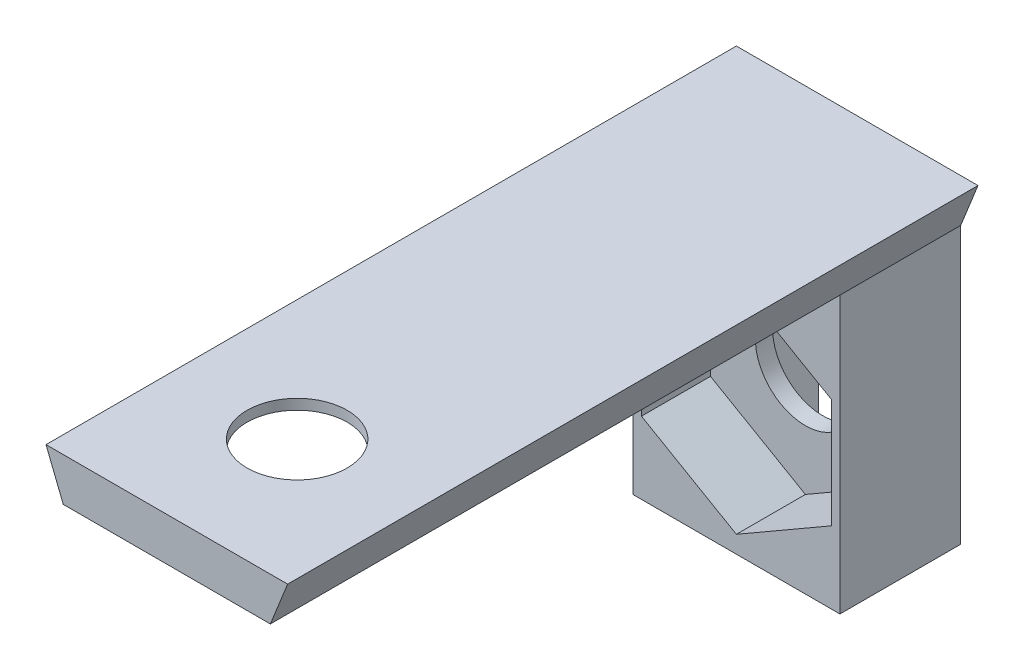
ISO-10303-21;
HEADER;
FILE_DESCRIPTION(('STEP AP214'),'2;1');
FILE_NAME('part.step','',(''),(''),'','','');
FILE_SCHEMA(('AUTOMOTIVE_DESIGN { 1 0 10303 214 1 1 1 1 }'));
ENDSEC;
DATA;
#1=APPLICATION_CONTEXT('core data for automotive mechanical design processes');
#2=APPLICATION_PROTOCOL_DEFINITION('international standard','automotive_design',2000,#1);
#3=PRODUCT_CONTEXT('',#1,'mechanical');
#4=PRODUCT('Part','Part','',(#3));
#5=PRODUCT_RELATED_PRODUCT_CATEGORY('part','',(#4));
#6=PRODUCT_DEFINITION_FORMATION('','',#4);
#7=PRODUCT_DEFINITION_CONTEXT('part definition',#1,'design');
#8=PRODUCT_DEFINITION('design','',#6,#7);
#9=PRODUCT_DEFINITION_SHAPE('','',#8);
#10=(LENGTH_UNIT() NAMED_UNIT(*) SI_UNIT(.MILLI.,.METRE.));
#11=(NAMED_UNIT(*) PLANE_ANGLE_UNIT() SI_UNIT($,.RADIAN.));
#12=(NAMED_UNIT(*) SI_UNIT($,.STERADIAN.) SOLID_ANGLE_UNIT());
#13=UNCERTAINTY_MEASURE_WITH_UNIT(LENGTH_MEASURE(1.E-05),#10,'distance_accuracy_value','');
#14=(GEOMETRIC_REPRESENTATION_CONTEXT(3) GLOBAL_UNCERTAINTY_ASSIGNED_CONTEXT((#13)) GLOBAL_UNIT_ASSIGNED_CONTEXT((#10,
#11,#12)) REPRESENTATION_CONTEXT('',''));
#15=CARTESIAN_POINT('',(0.,0.,0.));
#16=DIRECTION('',(0.,0.,1.));
#17=DIRECTION('',(1.,0.,0.));
#18=AXIS2_PLACEMENT_3D('',#15,#16,#17);
#19=CARTESIAN_POINT('',(0.,7.35,-3.501));
#20=DIRECTION('',(0.,0.,1.));
#21=DIRECTION('',(1.,0.,0.));
#22=AXIS2_PLACEMENT_3D('',#19,#20,#21);
#23=CYLINDRICAL_SURFACE('',#22,2.9);
#24=CARTESIAN_POINT('',(0.,7.35,-1.5));
#25=DIRECTION('',(0.,0.,1.));
#26=DIRECTION('',(1.,0.,0.));
#27=AXIS2_PLACEMENT_3D('',#24,#25,#26);
#28=CIRCLE('',#27,2.9);
#29=CARTESIAN_POINT('',(2.9,7.35,-1.5));
#30=VERTEX_POINT('',#29);
#31=EDGE_CURVE('E378',#30,#30,#28,.F.);
#32=CARTESIAN_POINT('',(0.,7.35,-0.500000000000002));
#33=DIRECTION('',(0.,0.,1.));
#34=DIRECTION('',(1.,0.,0.));
#35=AXIS2_PLACEMENT_3D('',#32,#33,#34);
#36=CIRCLE('',#35,2.9);
#37=CARTESIAN_POINT('',(2.9,7.35,-0.500000000000003));
#38=VERTEX_POINT('',#37);
#39=EDGE_CURVE('E43',#38,#38,#36,.F.);
#40=CARTESIAN_POINT('',(2.9,7.35,-1.5));
#41=CARTESIAN_POINT('',(2.9,7.35,-1.48958333333334));
#42=CARTESIAN_POINT('',(2.9,7.35,-1.47916666666667));
#43=CARTESIAN_POINT('',(2.9,7.35,-1.45833333333334));
#44=CARTESIAN_POINT('',(2.9,7.35,-1.44791666666667));
#45=CARTESIAN_POINT('',(2.9,7.35,-1.42708333333334));
#46=CARTESIAN_POINT('',(2.9,7.35,-1.41666666666667));
#47=CARTESIAN_POINT('',(2.9,7.35,-1.39583333333334));
#48=CARTESIAN_POINT('',(2.9,7.35,-1.38541666666667));
#49=CARTESIAN_POINT('',(2.9,7.35,-1.36458333333334));
#50=CARTESIAN_POINT('',(2.9,7.35,-1.35416666666667));
#51=CARTESIAN_POINT('',(2.9,7.35,-1.33333333333334));
#52=CARTESIAN_POINT('',(2.9,7.35,-1.32291666666667));
#53=CARTESIAN_POINT('',(2.9,7.35,-1.30208333333334));
#54=CARTESIAN_POINT('',(2.9,7.35,-1.29166666666667));
#55=CARTESIAN_POINT('',(2.9,7.35,-1.27083333333334));
#56=CARTESIAN_POINT('',(2.9,7.35,-1.26041666666667));
#57=CARTESIAN_POINT('',(2.9,7.35,-1.23958333333334));
#58=CARTESIAN_POINT('',(2.9,7.35,-1.22916666666667));
#59=CARTESIAN_POINT('',(2.9,7.35,-1.20833333333334));
#60=CARTESIAN_POINT('',(2.9,7.35,-1.19791666666667));
#61=CARTESIAN_POINT('',(2.9,7.35,-1.17708333333334));
#62=CARTESIAN_POINT('',(2.9,7.35,-1.16666666666667));
#63=CARTESIAN_POINT('',(2.9,7.35,-1.14583333333334));
#64=CARTESIAN_POINT('',(2.9,7.35,-1.13541666666667));
#65=CARTESIAN_POINT('',(2.9,7.35,-1.11458333333334));
#66=CARTESIAN_POINT('',(2.9,7.35,-1.10416666666667));
#67=CARTESIAN_POINT('',(2.9,7.35,-1.08333333333334));
#68=CARTESIAN_POINT('',(2.9,7.35,-1.07291666666667));
#69=CARTESIAN_POINT('',(2.9,7.35,-1.05208333333334));
#70=CARTESIAN_POINT('',(2.9,7.35,-1.04166666666667));
#71=CARTESIAN_POINT('',(2.9,7.35,-1.02083333333334));
#72=CARTESIAN_POINT('',(2.9,7.35,-1.01041666666667));
#73=CARTESIAN_POINT('',(2.9,7.35,-0.989583333333336));
#74=CARTESIAN_POINT('',(2.9,7.35,-0.979166666666669));
#75=CARTESIAN_POINT('',(2.9,7.35,-0.958333333333335));
#76=CARTESIAN_POINT('',(2.9,7.35,-0.947916666666669));
#77=CARTESIAN_POINT('',(2.9,7.35,-0.927083333333335));
#78=CARTESIAN_POINT('',(2.9,7.35,-0.916666666666669));
#79=CARTESIAN_POINT('',(2.9,7.35,-0.895833333333335));
#80=CARTESIAN_POINT('',(2.9,7.35,-0.885416666666669));
#81=CARTESIAN_POINT('',(2.9,7.35,-0.864583333333335));
#82=CARTESIAN_POINT('',(2.9,7.35,-0.854166666666669));
#83=CARTESIAN_POINT('',(2.9,7.35,-0.833333333333336));
#84=CARTESIAN_POINT('',(2.9,7.35,-0.822916666666669));
#85=CARTESIAN_POINT('',(2.9,7.35,-0.802083333333336));
#86=CARTESIAN_POINT('',(2.9,7.35,-0.791666666666669));
#87=CARTESIAN_POINT('',(2.9,7.35,-0.770833333333336));
#88=CARTESIAN_POINT('',(2.9,7.35,-0.760416666666669));
#89=CARTESIAN_POINT('',(2.9,7.35,-0.739583333333336));
#90=CARTESIAN_POINT('',(2.9,7.35,-0.729166666666669));
#91=CARTESIAN_POINT('',(2.9,7.35,-0.708333333333336));
#92=CARTESIAN_POINT('',(2.9,7.35,-0.697916666666669));
#93=CARTESIAN_POINT('',(2.9,7.35,-0.677083333333336));
#94=CARTESIAN_POINT('',(2.9,7.35,-0.666666666666669));
#95=CARTESIAN_POINT('',(2.9,7.35,-0.645833333333336));
#96=CARTESIAN_POINT('',(2.9,7.35,-0.635416666666669));
#97=CARTESIAN_POINT('',(2.9,7.35,-0.614583333333336));
#98=CARTESIAN_POINT('',(2.9,7.35,-0.604166666666669));
#99=CARTESIAN_POINT('',(2.9,7.35,-0.583333333333336));
#100=CARTESIAN_POINT('',(2.9,7.35,-0.572916666666669));
#101=CARTESIAN_POINT('',(2.9,7.35,-0.552083333333336));
#102=CARTESIAN_POINT('',(2.9,7.35,-0.541666666666669));
#103=CARTESIAN_POINT('',(2.9,7.35,-0.520833333333336));
#104=CARTESIAN_POINT('',(2.9,7.35,-0.510416666666669));
#105=CARTESIAN_POINT('',(2.9,7.35,-0.500000000000003));
#106=B_SPLINE_CURVE_WITH_KNOTS('',3,(#40,#41,#42,#43,#44,#45,#46,#47,#48,#49,#50,#51,#52,#53,
#54,#55,#56,#57,#58,#59,#60,#61,#62,#63,#64,#65,#66,#67,#68,#69,#70,#71,#72,#73,#74,#75,#76,#77,
#78,#79,#80,#81,#82,#83,#84,#85,#86,#87,#88,#89,#90,#91,#92,#93,#94,#95,#96,#97,#98,#99,#100,
#101,#102,#103,#104,#105),.UNSPECIFIED.,.F.,.F.,(4,2,2,2,2,2,2,2,2,2,2,2,2,2,2,2,2,2,2,2,2,2,2,
2,2,2,2,2,2,2,2,2,4),(0.,0.03125,0.0625000000000001,0.0937500000000001,0.125,0.15625,0.1875,
0.21875,0.25,0.28125,0.3125,0.34375,0.374999999999999,0.40625,0.4375,0.46875,0.5,0.53125,0.5625,
0.59375,0.625,0.65625,0.687499999999999,0.718749999999999,0.749999999999999,0.781249999999999,
0.812499999999999,0.843749999999999,0.874999999999999,0.906249999999999,0.937499999999999,
0.968749999999999,0.999999999999999),.UNSPECIFIED.);
#107=EDGE_CURVE('BSEAM39',#30,#38,#106,.T.);
#108=ORIENTED_EDGE('',*,*,#31,.T.);
#109=ORIENTED_EDGE('',*,*,#39,.F.);
#110=ORIENTED_EDGE('',*,*,#107,.T.);
#111=ORIENTED_EDGE('',*,*,#107,.F.);
#112=EDGE_LOOP('',(#108,#110,#109,#111));
#113=FACE_BOUND('',#112,.T.);
#114=ADVANCED_FACE('F39',(#113),#23,.F.);
#115=CARTESIAN_POINT('',(6.,16.,3.5));
#116=DIRECTION('',(-1.,0.,0.));
#117=DIRECTION('',(0.,0.,1.));
#118=AXIS2_PLACEMENT_3D('',#115,#116,#117);
#119=PLANE('',#118);
#120=DIRECTION('',(0.,0.,-1.));
#121=VECTOR('',#120,1.);
#122=CARTESIAN_POINT('',(6.,0.,3.5));
#123=LINE('',#122,#121);
#124=CARTESIAN_POINT('',(6.,0.,3.5));
#125=VERTEX_POINT('',#124);
#126=CARTESIAN_POINT('',(6.,0.,-3.5));
#127=VERTEX_POINT('',#126);
#128=EDGE_CURVE('E398',#125,#127,#123,.T.);
#129=ORIENTED_EDGE('',*,*,#128,.T.);
#130=DIRECTION('',(0.,-1.,0.));
#131=VECTOR('',#130,1.);
#132=CARTESIAN_POINT('',(6.,16.,-3.5));
#133=LINE('',#132,#131);
#134=CARTESIAN_POINT('',(6.,16.,-3.5));
#135=VERTEX_POINT('',#134);
#136=EDGE_CURVE('E443',#135,#127,#133,.T.);
#137=ORIENTED_EDGE('',*,*,#136,.F.);
#138=DIRECTION('',(0.,0.,-1.));
#139=VECTOR('',#138,1.);
#140=CARTESIAN_POINT('',(6.,16.,3.5));
#141=LINE('',#140,#139);
#142=CARTESIAN_POINT('',(6.,16.,3.5));
#143=VERTEX_POINT('',#142);
#144=EDGE_CURVE('E407',#143,#135,#141,.T.);
#145=ORIENTED_EDGE('',*,*,#144,.F.);
#146=DIRECTION('',(0.,-1.,0.));
#147=VECTOR('',#146,1.);
#148=CARTESIAN_POINT('',(6.,16.,3.5));
#149=LINE('',#148,#147);
#150=EDGE_CURVE('E418',#143,#125,#149,.T.);
#151=ORIENTED_EDGE('',*,*,#150,.T.);
#152=EDGE_LOOP('',(#129,#137,#145,#151));
#153=FACE_BOUND('',#152,.T.);
#154=ADVANCED_FACE('F41',(#153),#119,.F.);
#155=CARTESIAN_POINT('',(-6.,16.,-3.5));
#156=DIRECTION('',(0.,0.,1.));
#157=DIRECTION('',(1.,0.,0.));
#158=AXIS2_PLACEMENT_3D('',#155,#156,#157);
#159=PLANE('',#158);
#160=DIRECTION('',(-1.,0.,0.));
#161=VECTOR('',#160,1.);
#162=CARTESIAN_POINT('',(-7.,18.5,-3.5));
#163=LINE('',#162,#161);
#164=CARTESIAN_POINT('',(7.,18.5,-3.5));
#165=VERTEX_POINT('',#164);
#166=CARTESIAN_POINT('',(-7.,18.5,-3.5));
#167=VERTEX_POINT('',#166);
#168=EDGE_CURVE('E304',#165,#167,#163,.T.);
#169=ORIENTED_EDGE('',*,*,#168,.F.);
#170=DIRECTION('',(0.371390676354104,0.928476690885259,0.));
#171=VECTOR('',#170,1.);
#172=CARTESIAN_POINT('',(7.,18.5,-3.5));
#173=LINE('',#172,#171);
#174=EDGE_CURVE('E272',#135,#165,#173,.T.);
#175=ORIENTED_EDGE('',*,*,#174,.F.);
#176=ORIENTED_EDGE('',*,*,#136,.T.);
#177=DIRECTION('',(-1.,0.,0.));
#178=VECTOR('',#177,1.);
#179=CARTESIAN_POINT('',(-6.,0.,-3.5));
#180=LINE('',#179,#178);
#181=CARTESIAN_POINT('',(2.25,0.,-3.5));
#182=VERTEX_POINT('',#181);
#183=EDGE_CURVE('E423',#127,#182,#180,.T.);
#184=ORIENTED_EDGE('',*,*,#183,.T.);
#185=DIRECTION('',(0.,1.,0.));
#186=VECTOR('',#185,1.);
#187=CARTESIAN_POINT('',(2.25,-4.,-3.5));
#188=LINE('',#187,#186);
#189=CARTESIAN_POINT('',(2.25,16.,-3.5));
#190=VERTEX_POINT('',#189);
#191=EDGE_CURVE('E394',#182,#190,#188,.T.);
#192=ORIENTED_EDGE('',*,*,#191,.T.);
#193=DIRECTION('',(-1.,0.,0.));
#194=VECTOR('',#193,1.);
#195=CARTESIAN_POINT('',(-7.,16.,-3.5));
#196=LINE('',#195,#194);
#197=CARTESIAN_POINT('',(-2.25,16.,-3.5));
#198=VERTEX_POINT('',#197);
#199=EDGE_CURVE('E296',#190,#198,#196,.T.);
#200=ORIENTED_EDGE('',*,*,#199,.T.);
#201=DIRECTION('',(0.,1.,0.));
#202=VECTOR('',#201,1.);
#203=CARTESIAN_POINT('',(-2.25,-4.,-3.5));
#204=LINE('',#203,#202);
#205=CARTESIAN_POINT('',(-2.25,0.,-3.5));
#206=VERTEX_POINT('',#205);
#207=EDGE_CURVE('E393',#206,#198,#204,.T.);
#208=ORIENTED_EDGE('',*,*,#207,.F.);
#209=CARTESIAN_POINT('',(-6.,0.,-3.5));
#210=VERTEX_POINT('',#209);
#211=EDGE_CURVE('E422',#206,#210,#180,.T.);
#212=ORIENTED_EDGE('',*,*,#211,.T.);
#213=DIRECTION('',(0.,-1.,0.));
#214=VECTOR('',#213,1.);
#215=CARTESIAN_POINT('',(-6.,16.,-3.5));
#216=LINE('',#215,#214);
#217=CARTESIAN_POINT('',(-6.,16.,-3.5));
#218=VERTEX_POINT('',#217);
#219=EDGE_CURVE('E439',#218,#210,#216,.T.);
#220=ORIENTED_EDGE('',*,*,#219,.F.);
#221=DIRECTION('',(0.371390676354104,-0.928476690885259,0.));
#222=VECTOR('',#221,1.);
#223=CARTESIAN_POINT('',(-6.,16.,-3.5));
#224=LINE('',#223,#222);
#225=EDGE_CURVE('E260',#167,#218,#224,.T.);
#226=ORIENTED_EDGE('',*,*,#225,.F.);
#227=EDGE_LOOP('',(#169,#175,#176,#184,#192,#200,#208,#212,#220,#226));
#228=FACE_BOUND('',#227,.T.);
#229=ADVANCED_FACE('F468',(#228),#159,.F.);
#230=CARTESIAN_POINT('',(-6.,16.,3.5));
#231=DIRECTION('',(1.,0.,0.));
#232=DIRECTION('',(0.,0.,-1.));
#233=AXIS2_PLACEMENT_3D('',#230,#231,#232);
#234=PLANE('',#233);
#235=DIRECTION('',(0.,0.,1.));
#236=VECTOR('',#235,1.);
#237=CARTESIAN_POINT('',(-6.,0.,3.5));
#238=LINE('',#237,#236);
#239=CARTESIAN_POINT('',(-6.,0.,3.5));
#240=VERTEX_POINT('',#239);
#241=EDGE_CURVE('E427',#210,#240,#238,.T.);
#242=ORIENTED_EDGE('',*,*,#241,.T.);
#243=DIRECTION('',(0.,-1.,0.));
#244=VECTOR('',#243,1.);
#245=CARTESIAN_POINT('',(-6.,16.,3.5));
#246=LINE('',#245,#244);
#247=CARTESIAN_POINT('',(-6.,16.,3.5));
#248=VERTEX_POINT('',#247);
#249=EDGE_CURVE('E435',#248,#240,#246,.T.);
#250=ORIENTED_EDGE('',*,*,#249,.F.);
#251=DIRECTION('',(0.,0.,1.));
#252=VECTOR('',#251,1.);
#253=CARTESIAN_POINT('',(-6.,16.,3.5));
#254=LINE('',#253,#252);
#255=EDGE_CURVE('E410',#218,#248,#254,.T.);
#256=ORIENTED_EDGE('',*,*,#255,.F.);
#257=ORIENTED_EDGE('',*,*,#219,.T.);
#258=EDGE_LOOP('',(#242,#250,#256,#257));
#259=FACE_BOUND('',#258,.T.);
#260=ADVANCED_FACE('F490',(#259),#234,.F.);
#261=CARTESIAN_POINT('',(-6.,16.,3.5));
#262=DIRECTION('',(0.,0.,-1.));
#263=DIRECTION('',(-1.,0.,0.));
#264=AXIS2_PLACEMENT_3D('',#261,#262,#263);
#265=PLANE('',#264);
#266=DIRECTION('',(-0.866025403784438,-0.5,0.));
#267=VECTOR('',#266,1.);
#268=CARTESIAN_POINT('',(0.,13.7008529610859,3.5));
#269=LINE('',#268,#267);
#270=CARTESIAN_POINT('',(0.,13.7008529610859,3.5));
#271=VERTEX_POINT('',#270);
#272=CARTESIAN_POINT('',(-5.5,10.5254264805429,3.5));
#273=VERTEX_POINT('',#272);
#274=EDGE_CURVE('E342',#271,#273,#269,.T.);
#275=ORIENTED_EDGE('',*,*,#274,.F.);
#276=DIRECTION('',(-0.866025403784439,0.5,0.));
#277=VECTOR('',#276,1.);
#278=CARTESIAN_POINT('',(5.5,10.5254264805429,3.5));
#279=LINE('',#278,#277);
#280=CARTESIAN_POINT('',(5.5,10.5254264805429,3.5));
#281=VERTEX_POINT('',#280);
#282=EDGE_CURVE('E64',#281,#271,#279,.T.);
#283=ORIENTED_EDGE('',*,*,#282,.F.);
#284=DIRECTION('',(0.,1.,0.));
#285=VECTOR('',#284,1.);
#286=CARTESIAN_POINT('',(5.5,4.17457351945706,3.5));
#287=LINE('',#286,#285);
#288=CARTESIAN_POINT('',(5.5,4.17457351945706,3.5));
#289=VERTEX_POINT('',#288);
#290=EDGE_CURVE('E319',#289,#281,#287,.T.);
#291=ORIENTED_EDGE('',*,*,#290,.F.);
#292=DIRECTION('',(0.866025403784438,0.5,0.));
#293=VECTOR('',#292,1.);
#294=CARTESIAN_POINT('',(0.,0.999147038914115,3.5));
#295=LINE('',#294,#293);
#296=CARTESIAN_POINT('',(0.,0.999147038914115,3.5));
#297=VERTEX_POINT('',#296);
#298=EDGE_CURVE('E354',#297,#289,#295,.T.);
#299=ORIENTED_EDGE('',*,*,#298,.F.);
#300=DIRECTION('',(0.866025403784438,-0.5,0.));
#301=VECTOR('',#300,1.);
#302=CARTESIAN_POINT('',(-5.5,4.17457351945706,3.5));
#303=LINE('',#302,#301);
#304=CARTESIAN_POINT('',(-5.5,4.17457351945706,3.5));
#305=VERTEX_POINT('',#304);
#306=EDGE_CURVE('E350',#305,#297,#303,.T.);
#307=ORIENTED_EDGE('',*,*,#306,.F.);
#308=DIRECTION('',(0.,-1.,0.));
#309=VECTOR('',#308,1.);
#310=CARTESIAN_POINT('',(-5.5,10.5254264805429,3.5));
#311=LINE('',#310,#309);
#312=EDGE_CURVE('E346',#273,#305,#311,.T.);
#313=ORIENTED_EDGE('',*,*,#312,.F.);
#314=EDGE_LOOP('',(#275,#283,#291,#299,#307,#313));
#315=FACE_BOUND('',#314,.T.);
#316=DIRECTION('',(1.,0.,0.));
#317=VECTOR('',#316,1.);
#318=CARTESIAN_POINT('',(-6.,0.,3.5));
#319=LINE('',#318,#317);
#320=EDGE_CURVE('E411',#240,#125,#319,.T.);
#321=ORIENTED_EDGE('',*,*,#320,.T.);
#322=ORIENTED_EDGE('',*,*,#150,.F.);
#323=DIRECTION('',(1.,0.,0.));
#324=VECTOR('',#323,1.);
#325=CARTESIAN_POINT('',(-6.,16.,3.5));
#326=LINE('',#325,#324);
#327=EDGE_CURVE('E414',#248,#143,#326,.T.);
#328=ORIENTED_EDGE('',*,*,#327,.F.);
#329=ORIENTED_EDGE('',*,*,#249,.T.);
#330=EDGE_LOOP('',(#321,#322,#328,#329));
#331=FACE_BOUND('',#330,.T.);
#332=ADVANCED_FACE('F485',(#315,#331),#265,.F.);
#333=CARTESIAN_POINT('',(0.,0.,0.));
#334=DIRECTION('',(0.,-1.,0.));
#335=DIRECTION('',(0.,0.,-1.));
#336=AXIS2_PLACEMENT_3D('',#333,#334,#335);
#337=PLANE('',#336);
#338=DIRECTION('',(0.707106781186548,0.,0.707106781186547));
#339=VECTOR('',#338,1.);
#340=CARTESIAN_POINT('',(2.875,0.,-2.875));
#341=LINE('',#340,#339);
#342=CARTESIAN_POINT('',(4.25,0.,-1.5));
#343=VERTEX_POINT('',#342);
#344=EDGE_CURVE('E11',#182,#343,#341,.T.);
#345=ORIENTED_EDGE('',*,*,#344,.F.);
#346=ORIENTED_EDGE('',*,*,#183,.F.);
#347=ORIENTED_EDGE('',*,*,#128,.F.);
#348=ORIENTED_EDGE('',*,*,#320,.F.);
#349=ORIENTED_EDGE('',*,*,#241,.F.);
#350=ORIENTED_EDGE('',*,*,#211,.F.);
#351=DIRECTION('',(0.707106781186547,0.,-0.707106781186548));
#352=VECTOR('',#351,1.);
#353=CARTESIAN_POINT('',(-2.875,0.,-2.875));
#354=LINE('',#353,#352);
#355=CARTESIAN_POINT('',(-4.25,0.,-1.5));
#356=VERTEX_POINT('',#355);
#357=EDGE_CURVE('E447',#356,#206,#354,.T.);
#358=ORIENTED_EDGE('',*,*,#357,.F.);
#359=DIRECTION('',(-1.,0.,0.));
#360=VECTOR('',#359,1.);
#361=CARTESIAN_POINT('',(0.,0.,-1.5));
#362=LINE('',#361,#360);
#363=EDGE_CURVE('E49',#343,#356,#362,.T.);
#364=ORIENTED_EDGE('',*,*,#363,.F.);
#365=EDGE_LOOP('',(#345,#346,#347,#348,#349,#350,#358,#364));
#366=FACE_BOUND('',#365,.T.);
#367=ADVANCED_FACE('F460',(#366),#337,.T.);
#368=CARTESIAN_POINT('',(2.25,-4.,-3.5));
#369=DIRECTION('',(0.707106781186547,0.,-0.707106781186548));
#370=DIRECTION('',(-0.707106781186548,0.,-0.707106781186547));
#371=AXIS2_PLACEMENT_3D('',#368,#369,#370);
#372=PLANE('',#371);
#373=ORIENTED_EDGE('',*,*,#344,.T.);
#374=DIRECTION('',(0.,1.,0.));
#375=VECTOR('',#374,1.);
#376=CARTESIAN_POINT('',(4.25,-4.,-1.5));
#377=LINE('',#376,#375);
#378=CARTESIAN_POINT('',(4.25,16.,-1.5));
#379=VERTEX_POINT('',#378);
#380=EDGE_CURVE('E399',#343,#379,#377,.T.);
#381=ORIENTED_EDGE('',*,*,#380,.T.);
#382=DIRECTION('',(-0.707106781186548,0.,-0.707106781186547));
#383=VECTOR('',#382,1.);
#384=CARTESIAN_POINT('',(2.25,16.,-3.5));
#385=LINE('',#384,#383);
#386=EDGE_CURVE('E390',#379,#190,#385,.T.);
#387=ORIENTED_EDGE('',*,*,#386,.T.);
#388=ORIENTED_EDGE('',*,*,#191,.F.);
#389=EDGE_LOOP('',(#373,#381,#387,#388));
#390=FACE_BOUND('',#389,.T.);
#391=ADVANCED_FACE('F476',(#390),#372,.F.);
#392=CARTESIAN_POINT('',(0.,-4.,-1.5));
#393=DIRECTION('',(0.,0.,1.));
#394=DIRECTION('',(1.,0.,0.));
#395=AXIS2_PLACEMENT_3D('',#392,#393,#394);
#396=PLANE('',#395);
#397=ORIENTED_EDGE('',*,*,#31,.F.);
#398=EDGE_LOOP('',(#397));
#399=FACE_BOUND('',#398,.T.);
#400=ORIENTED_EDGE('',*,*,#363,.T.);
#401=DIRECTION('',(0.,1.,0.));
#402=VECTOR('',#401,1.);
#403=CARTESIAN_POINT('',(-4.25,-4.,-1.5));
#404=LINE('',#403,#402);
#405=CARTESIAN_POINT('',(-4.25,16.,-1.5));
#406=VERTEX_POINT('',#405);
#407=EDGE_CURVE('E402',#356,#406,#404,.T.);
#408=ORIENTED_EDGE('',*,*,#407,.T.);
#409=DIRECTION('',(1.,0.,0.));
#410=VECTOR('',#409,1.);
#411=CARTESIAN_POINT('',(0.,16.,-1.5));
#412=LINE('',#411,#410);
#413=EDGE_CURVE('E386',#406,#379,#412,.T.);
#414=ORIENTED_EDGE('',*,*,#413,.T.);
#415=ORIENTED_EDGE('',*,*,#380,.F.);
#416=EDGE_LOOP('',(#400,#408,#414,#415));
#417=FACE_BOUND('',#416,.T.);
#418=ADVANCED_FACE('F456',(#399,#417),#396,.F.);
#419=CARTESIAN_POINT('',(-4.25,-4.,-1.5));
#420=DIRECTION('',(-0.707106781186548,0.,-0.707106781186547));
#421=DIRECTION('',(-0.707106781186547,0.,0.707106781186548));
#422=AXIS2_PLACEMENT_3D('',#419,#420,#421);
#423=PLANE('',#422);
#424=ORIENTED_EDGE('',*,*,#357,.T.);
#425=ORIENTED_EDGE('',*,*,#207,.T.);
#426=DIRECTION('',(-0.707106781186547,0.,0.707106781186548));
#427=VECTOR('',#426,1.);
#428=CARTESIAN_POINT('',(-4.25,16.,-1.5));
#429=LINE('',#428,#427);
#430=EDGE_CURVE('E382',#198,#406,#429,.T.);
#431=ORIENTED_EDGE('',*,*,#430,.T.);
#432=ORIENTED_EDGE('',*,*,#407,.F.);
#433=EDGE_LOOP('',(#424,#425,#431,#432));
#434=FACE_BOUND('',#433,.T.);
#435=ADVANCED_FACE('F464',(#434),#423,.F.);
#436=CARTESIAN_POINT('',(0.,0.,-0.500000000000002));
#437=DIRECTION('',(0.,0.,1.));
#438=DIRECTION('',(1.,0.,0.));
#439=AXIS2_PLACEMENT_3D('',#436,#437,#438);
#440=PLANE('',#439);
#441=DIRECTION('',(-0.866025403784439,0.5,0.));
#442=VECTOR('',#441,1.);
#443=CARTESIAN_POINT('',(5.5,10.5254264805429,-0.500000000000002));
#444=LINE('',#443,#442);
#445=CARTESIAN_POINT('',(5.5,10.5254264805429,-0.500000000000002));
#446=VERTEX_POINT('',#445);
#447=CARTESIAN_POINT('',(0.,13.7008529610859,-0.500000000000002));
#448=VERTEX_POINT('',#447);
#449=EDGE_CURVE('E314',#446,#448,#444,.T.);
#450=ORIENTED_EDGE('',*,*,#449,.T.);
#451=DIRECTION('',(-0.866025403784438,-0.5,0.));
#452=VECTOR('',#451,1.);
#453=CARTESIAN_POINT('',(0.,13.7008529610859,-0.500000000000002));
#454=LINE('',#453,#452);
#455=CARTESIAN_POINT('',(-5.5,10.5254264805429,-0.500000000000002));
#456=VERTEX_POINT('',#455);
#457=EDGE_CURVE('E318',#448,#456,#454,.T.);
#458=ORIENTED_EDGE('',*,*,#457,.T.);
#459=DIRECTION('',(0.,-1.,0.));
#460=VECTOR('',#459,1.);
#461=CARTESIAN_POINT('',(-5.5,10.5254264805429,-0.500000000000002));
#462=LINE('',#461,#460);
#463=CARTESIAN_POINT('',(-5.5,4.17457351945706,-0.500000000000002));
#464=VERTEX_POINT('',#463);
#465=EDGE_CURVE('E323',#456,#464,#462,.T.);
#466=ORIENTED_EDGE('',*,*,#465,.T.);
#467=DIRECTION('',(0.866025403784438,-0.5,0.));
#468=VECTOR('',#467,1.);
#469=CARTESIAN_POINT('',(-5.5,4.17457351945706,-0.500000000000002));
#470=LINE('',#469,#468);
#471=CARTESIAN_POINT('',(0.,0.999147038914115,-0.500000000000002));
#472=VERTEX_POINT('',#471);
#473=EDGE_CURVE('E327',#464,#472,#470,.T.);
#474=ORIENTED_EDGE('',*,*,#473,.T.);
#475=DIRECTION('',(0.866025403784438,0.5,0.));
#476=VECTOR('',#475,1.);
#477=CARTESIAN_POINT('',(0.,0.999147038914115,-0.500000000000002));
#478=LINE('',#477,#476);
#479=CARTESIAN_POINT('',(5.5,4.17457351945706,-0.500000000000002));
#480=VERTEX_POINT('',#479);
#481=EDGE_CURVE('E331',#472,#480,#478,.T.);
#482=ORIENTED_EDGE('',*,*,#481,.T.);
#483=DIRECTION('',(0.,1.,0.));
#484=VECTOR('',#483,1.);
#485=CARTESIAN_POINT('',(5.5,4.17457351945706,-0.500000000000002));
#486=LINE('',#485,#484);
#487=EDGE_CURVE('E335',#480,#446,#486,.T.);
#488=ORIENTED_EDGE('',*,*,#487,.T.);
#489=EDGE_LOOP('',(#450,#458,#466,#474,#482,#488));
#490=FACE_BOUND('',#489,.T.);
#491=ORIENTED_EDGE('',*,*,#39,.T.);
#492=EDGE_LOOP('',(#491));
#493=FACE_BOUND('',#492,.T.);
#494=ADVANCED_FACE('F534',(#490,#493),#440,.T.);
#495=CARTESIAN_POINT('',(5.5,10.5254264805429,-0.500000000000002));
#496=DIRECTION('',(0.5,0.866025403784439,0.));
#497=DIRECTION('',(-0.866025403784439,0.5,0.));
#498=AXIS2_PLACEMENT_3D('',#495,#496,#497);
#499=PLANE('',#498);
#500=ORIENTED_EDGE('',*,*,#282,.T.);
#501=DIRECTION('',(0.,0.,1.));
#502=VECTOR('',#501,1.);
#503=CARTESIAN_POINT('',(0.,13.7008529610859,-0.500000000000002));
#504=LINE('',#503,#502);
#505=EDGE_CURVE('E339',#448,#271,#504,.T.);
#506=ORIENTED_EDGE('',*,*,#505,.F.);
#507=ORIENTED_EDGE('',*,*,#449,.F.);
#508=DIRECTION('',(0.,0.,1.));
#509=VECTOR('',#508,1.);
#510=CARTESIAN_POINT('',(5.5,10.5254264805429,-0.500000000000002));
#511=LINE('',#510,#509);
#512=EDGE_CURVE('E361',#446,#281,#511,.T.);
#513=ORIENTED_EDGE('',*,*,#512,.T.);
#514=EDGE_LOOP('',(#500,#506,#507,#513));
#515=FACE_BOUND('',#514,.T.);
#516=ADVANCED_FACE('F525',(#515),#499,.F.);
#517=CARTESIAN_POINT('',(5.5,4.17457351945706,-0.500000000000002));
#518=DIRECTION('',(1.,0.,0.));
#519=DIRECTION('',(0.,0.,-1.));
#520=AXIS2_PLACEMENT_3D('',#517,#518,#519);
#521=PLANE('',#520);
#522=ORIENTED_EDGE('',*,*,#290,.T.);
#523=ORIENTED_EDGE('',*,*,#512,.F.);
#524=ORIENTED_EDGE('',*,*,#487,.F.);
#525=DIRECTION('',(0.,0.,1.));
#526=VECTOR('',#525,1.);
#527=CARTESIAN_POINT('',(5.5,4.17457351945706,-0.500000000000002));
#528=LINE('',#527,#526);
#529=EDGE_CURVE('E364',#480,#289,#528,.T.);
#530=ORIENTED_EDGE('',*,*,#529,.T.);
#531=EDGE_LOOP('',(#522,#523,#524,#530));
#532=FACE_BOUND('',#531,.T.);
#533=ADVANCED_FACE('F586',(#532),#521,.F.);
#534=CARTESIAN_POINT('',(0.,0.999147038914115,-0.500000000000002));
#535=DIRECTION('',(0.5,-0.866025403784439,0.));
#536=DIRECTION('',(0.866025403784439,0.5,0.));
#537=AXIS2_PLACEMENT_3D('',#534,#535,#536);
#538=PLANE('',#537);
#539=ORIENTED_EDGE('',*,*,#298,.T.);
#540=ORIENTED_EDGE('',*,*,#529,.F.);
#541=ORIENTED_EDGE('',*,*,#481,.F.);
#542=DIRECTION('',(0.,0.,1.));
#543=VECTOR('',#542,1.);
#544=CARTESIAN_POINT('',(0.,0.999147038914115,-0.500000000000002));
#545=LINE('',#544,#543);
#546=EDGE_CURVE('E367',#472,#297,#545,.T.);
#547=ORIENTED_EDGE('',*,*,#546,.T.);
#548=EDGE_LOOP('',(#539,#540,#541,#547));
#549=FACE_BOUND('',#548,.T.);
#550=ADVANCED_FACE('F592',(#549),#538,.F.);
#551=CARTESIAN_POINT('',(-5.5,4.17457351945706,-0.500000000000002));
#552=DIRECTION('',(-0.5,-0.866025403784439,0.));
#553=DIRECTION('',(0.866025403784438,-0.5,0.));
#554=AXIS2_PLACEMENT_3D('',#551,#552,#553);
#555=PLANE('',#554);
#556=ORIENTED_EDGE('',*,*,#306,.T.);
#557=ORIENTED_EDGE('',*,*,#546,.F.);
#558=ORIENTED_EDGE('',*,*,#473,.F.);
#559=DIRECTION('',(0.,0.,1.));
#560=VECTOR('',#559,1.);
#561=CARTESIAN_POINT('',(-5.5,4.17457351945706,-0.500000000000002));
#562=LINE('',#561,#560);
#563=EDGE_CURVE('E370',#464,#305,#562,.T.);
#564=ORIENTED_EDGE('',*,*,#563,.T.);
#565=EDGE_LOOP('',(#556,#557,#558,#564));
#566=FACE_BOUND('',#565,.T.);
#567=ADVANCED_FACE('F600',(#566),#555,.F.);
#568=CARTESIAN_POINT('',(-5.5,10.5254264805429,-0.500000000000002));
#569=DIRECTION('',(-1.,0.,0.));
#570=DIRECTION('',(0.,0.,1.));
#571=AXIS2_PLACEMENT_3D('',#568,#569,#570);
#572=PLANE('',#571);
#573=ORIENTED_EDGE('',*,*,#312,.T.);
#574=ORIENTED_EDGE('',*,*,#563,.F.);
#575=ORIENTED_EDGE('',*,*,#465,.F.);
#576=DIRECTION('',(0.,0.,1.));
#577=VECTOR('',#576,1.);
#578=CARTESIAN_POINT('',(-5.5,10.5254264805429,-0.500000000000002));
#579=LINE('',#578,#577);
#580=EDGE_CURVE('E373',#456,#273,#579,.T.);
#581=ORIENTED_EDGE('',*,*,#580,.T.);
#582=EDGE_LOOP('',(#573,#574,#575,#581));
#583=FACE_BOUND('',#582,.T.);
#584=ADVANCED_FACE('F608',(#583),#572,.F.);
#585=CARTESIAN_POINT('',(0.,13.7008529610859,-0.500000000000002));
#586=DIRECTION('',(-0.5,0.866025403784438,0.));
#587=DIRECTION('',(-0.866025403784439,-0.5,0.));
#588=AXIS2_PLACEMENT_3D('',#585,#586,#587);
#589=PLANE('',#588);
#590=ORIENTED_EDGE('',*,*,#274,.T.);
#591=ORIENTED_EDGE('',*,*,#580,.F.);
#592=ORIENTED_EDGE('',*,*,#457,.F.);
#593=ORIENTED_EDGE('',*,*,#505,.T.);
#594=EDGE_LOOP('',(#590,#591,#592,#593));
#595=FACE_BOUND('',#594,.T.);
#596=ADVANCED_FACE('F616',(#595),#589,.F.);
#597=CARTESIAN_POINT('',(0.,16.,0.));
#598=DIRECTION('',(0.,1.,0.));
#599=DIRECTION('',(0.,0.,1.));
#600=AXIS2_PLACEMENT_3D('',#597,#598,#599);
#601=PLANE('',#600);
#602=DIRECTION('',(0.866025403784439,0.,0.5));
#603=VECTOR('',#602,1.);
#604=CARTESIAN_POINT('',(0.,16.,22.5991470389141));
#605=LINE('',#604,#603);
#606=CARTESIAN_POINT('',(0.,16.,22.5991470389141));
#607=VERTEX_POINT('',#606);
#608=CARTESIAN_POINT('',(5.50000000000001,16.,25.7745735194571));
#609=VERTEX_POINT('',#608);
#610=EDGE_CURVE('E242',#607,#609,#605,.T.);
#611=ORIENTED_EDGE('',*,*,#610,.F.);
#612=DIRECTION('',(0.866025403784439,0.,-0.5));
#613=VECTOR('',#612,1.);
#614=CARTESIAN_POINT('',(-5.5,16.,25.7745735194571));
#615=LINE('',#614,#613);
#616=CARTESIAN_POINT('',(-5.5,16.,25.7745735194571));
#617=VERTEX_POINT('',#616);
#618=EDGE_CURVE('E56',#617,#607,#615,.T.);
#619=ORIENTED_EDGE('',*,*,#618,.F.);
#620=DIRECTION('',(0.,0.,-1.));
#621=VECTOR('',#620,1.);
#622=CARTESIAN_POINT('',(-5.5,16.,32.1254264805429));
#623=LINE('',#622,#621);
#624=CARTESIAN_POINT('',(-5.5,16.,32.1254264805429));
#625=VERTEX_POINT('',#624);
#626=EDGE_CURVE('E219',#625,#617,#623,.T.);
#627=ORIENTED_EDGE('',*,*,#626,.F.);
#628=DIRECTION('',(-0.866025403784439,0.,-0.5));
#629=VECTOR('',#628,1.);
#630=CARTESIAN_POINT('',(0.,16.,35.3008529610859));
#631=LINE('',#630,#629);
#632=CARTESIAN_POINT('',(0.,16.,35.3008529610859));
#633=VERTEX_POINT('',#632);
#634=EDGE_CURVE('E223',#633,#625,#631,.T.);
#635=ORIENTED_EDGE('',*,*,#634,.F.);
#636=DIRECTION('',(-0.866025403784438,0.,0.5));
#637=VECTOR('',#636,1.);
#638=CARTESIAN_POINT('',(5.5,16.,32.1254264805429));
#639=LINE('',#638,#637);
#640=CARTESIAN_POINT('',(5.5,16.,32.1254264805429));
#641=VERTEX_POINT('',#640);
#642=EDGE_CURVE('E250',#641,#633,#639,.T.);
#643=ORIENTED_EDGE('',*,*,#642,.F.);
#644=DIRECTION('',(0.,0.,1.));
#645=VECTOR('',#644,1.);
#646=CARTESIAN_POINT('',(5.50000000000001,16.,25.7745735194571));
#647=LINE('',#646,#645);
#648=EDGE_CURVE('E246',#609,#641,#647,.T.);
#649=ORIENTED_EDGE('',*,*,#648,.F.);
#650=EDGE_LOOP('',(#611,#619,#627,#635,#643,#649));
#651=FACE_BOUND('',#650,.T.);
#652=ORIENTED_EDGE('',*,*,#327,.T.);
#653=DIRECTION('',(0.,0.,-1.));
#654=VECTOR('',#653,1.);
#655=CARTESIAN_POINT('',(6.,16.,36.501));
#656=LINE('',#655,#654);
#657=CARTESIAN_POINT('',(6.,16.,36.5));
#658=VERTEX_POINT('',#657);
#659=EDGE_CURVE('E275',#658,#143,#656,.T.);
#660=ORIENTED_EDGE('',*,*,#659,.F.);
#661=DIRECTION('',(1.,0.,0.));
#662=VECTOR('',#661,1.);
#663=CARTESIAN_POINT('',(-6.99999999999999,16.,36.5));
#664=LINE('',#663,#662);
#665=CARTESIAN_POINT('',(-6.,16.,36.5));
#666=VERTEX_POINT('',#665);
#667=EDGE_CURVE('E282',#666,#658,#664,.T.);
#668=ORIENTED_EDGE('',*,*,#667,.F.);
#669=DIRECTION('',(0.,0.,-1.));
#670=VECTOR('',#669,1.);
#671=CARTESIAN_POINT('',(-6.,16.,36.501));
#672=LINE('',#671,#670);
#673=EDGE_CURVE('E285',#666,#248,#672,.T.);
#674=ORIENTED_EDGE('',*,*,#673,.T.);
#675=EDGE_LOOP('',(#652,#660,#668,#674));
#676=FACE_BOUND('',#675,.T.);
#677=ADVANCED_FACE('F505',(#651,#676),#601,.F.);
#678=CARTESIAN_POINT('',(-6.99999999999999,18.5,36.5));
#679=DIRECTION('',(0.,0.,-1.));
#680=DIRECTION('',(-1.,0.,0.));
#681=AXIS2_PLACEMENT_3D('',#678,#679,#680);
#682=PLANE('',#681);
#683=ORIENTED_EDGE('',*,*,#667,.T.);
#684=DIRECTION('',(-0.371390676354104,-0.92847669088526,0.));
#685=VECTOR('',#684,1.);
#686=CARTESIAN_POINT('',(7.,18.5,36.5));
#687=LINE('',#686,#685);
#688=CARTESIAN_POINT('',(7.,18.5,36.5));
#689=VERTEX_POINT('',#688);
#690=EDGE_CURVE('E279',#689,#658,#687,.T.);
#691=ORIENTED_EDGE('',*,*,#690,.F.);
#692=DIRECTION('',(1.,0.,0.));
#693=VECTOR('',#692,1.);
#694=CARTESIAN_POINT('',(-6.99999999999999,18.5,36.5));
#695=LINE('',#694,#693);
#696=CARTESIAN_POINT('',(-6.99999999999999,18.5,36.5));
#697=VERTEX_POINT('',#696);
#698=EDGE_CURVE('E295',#697,#689,#695,.T.);
#699=ORIENTED_EDGE('',*,*,#698,.F.);
#700=DIRECTION('',(-0.371390676354104,0.928476690885259,0.));
#701=VECTOR('',#700,1.);
#702=CARTESIAN_POINT('',(-6.,16.,36.5));
#703=LINE('',#702,#701);
#704=EDGE_CURVE('E276',#666,#697,#703,.T.);
#705=ORIENTED_EDGE('',*,*,#704,.F.);
#706=EDGE_LOOP('',(#683,#691,#699,#705));
#707=FACE_BOUND('',#706,.T.);
#708=ADVANCED_FACE('F501',(#707),#682,.F.);
#709=CARTESIAN_POINT('',(0.,18.5,0.));
#710=DIRECTION('',(0.,1.,0.));
#711=DIRECTION('',(0.,0.,1.));
#712=AXIS2_PLACEMENT_3D('',#709,#710,#711);
#713=PLANE('',#712);
#714=CARTESIAN_POINT('',(0.,18.5,28.95));
#715=DIRECTION('',(0.,1.,0.));
#716=DIRECTION('',(0.,0.,1.));
#717=AXIS2_PLACEMENT_3D('',#714,#715,#716);
#718=CIRCLE('',#717,2.9);
#719=CARTESIAN_POINT('',(0.,18.5,31.85));
#720=VERTEX_POINT('',#719);
#721=EDGE_CURVE('E226',#720,#720,#718,.F.);
#722=ORIENTED_EDGE('',*,*,#721,.T.);
#723=EDGE_LOOP('',(#722));
#724=FACE_BOUND('',#723,.T.);
#725=DIRECTION('',(0.,0.,1.));
#726=VECTOR('',#725,1.);
#727=CARTESIAN_POINT('',(-7.,18.5,-3.5));
#728=LINE('',#727,#726);
#729=EDGE_CURVE('E291',#167,#697,#728,.T.);
#730=ORIENTED_EDGE('',*,*,#729,.T.);
#731=ORIENTED_EDGE('',*,*,#698,.T.);
#732=DIRECTION('',(0.,0.,-1.));
#733=VECTOR('',#732,1.);
#734=CARTESIAN_POINT('',(7.,18.5,-3.5));
#735=LINE('',#734,#733);
#736=EDGE_CURVE('E300',#689,#165,#735,.T.);
#737=ORIENTED_EDGE('',*,*,#736,.T.);
#738=ORIENTED_EDGE('',*,*,#168,.T.);
#739=EDGE_LOOP('',(#730,#731,#737,#738));
#740=FACE_BOUND('',#739,.T.);
#741=ADVANCED_FACE('F494',(#724,#740),#713,.T.);
#742=ORIENTED_EDGE('',*,*,#386,.F.);
#743=ORIENTED_EDGE('',*,*,#413,.F.);
#744=ORIENTED_EDGE('',*,*,#430,.F.);
#745=ORIENTED_EDGE('',*,*,#199,.F.);
#746=EDGE_LOOP('',(#742,#743,#744,#745));
#747=FACE_BOUND('',#746,.T.);
#748=ADVANCED_FACE('F473',(#747),#601,.F.);
#749=CARTESIAN_POINT('',(-6.,16.,36.501));
#750=DIRECTION('',(0.928476690885259,0.371390676354104,0.));
#751=DIRECTION('',(-0.371390676354104,0.928476690885259,0.));
#752=AXIS2_PLACEMENT_3D('',#749,#750,#751);
#753=PLANE('',#752);
#754=ORIENTED_EDGE('',*,*,#704,.T.);
#755=ORIENTED_EDGE('',*,*,#729,.F.);
#756=ORIENTED_EDGE('',*,*,#225,.T.);
#757=ORIENTED_EDGE('',*,*,#255,.T.);
#758=ORIENTED_EDGE('',*,*,#673,.F.);
#759=EDGE_LOOP('',(#754,#755,#756,#757,#758));
#760=FACE_BOUND('',#759,.T.);
#761=ADVANCED_FACE('F506',(#760),#753,.F.);
#762=CARTESIAN_POINT('',(7.,18.5,36.501));
#763=DIRECTION('',(-0.928476690885259,0.371390676354104,0.));
#764=DIRECTION('',(-0.371390676354104,-0.92847669088526,0.));
#765=AXIS2_PLACEMENT_3D('',#762,#763,#764);
#766=PLANE('',#765);
#767=ORIENTED_EDGE('',*,*,#690,.T.);
#768=ORIENTED_EDGE('',*,*,#659,.T.);
#769=ORIENTED_EDGE('',*,*,#144,.T.);
#770=ORIENTED_EDGE('',*,*,#174,.T.);
#771=ORIENTED_EDGE('',*,*,#736,.F.);
#772=EDGE_LOOP('',(#767,#768,#769,#770,#771));
#773=FACE_BOUND('',#772,.T.);
#774=ADVANCED_FACE('F498',(#773),#766,.F.);
#775=CARTESIAN_POINT('',(-5.5,17.9,25.7745735194571));
#776=DIRECTION('',(-0.5,0.,-0.866025403784438));
#777=DIRECTION('',(-0.866025403784439,0.,0.5));
#778=AXIS2_PLACEMENT_3D('',#775,#776,#777);
#779=PLANE('',#778);
#780=ORIENTED_EDGE('',*,*,#618,.T.);
#781=DIRECTION('',(0.,-1.,0.));
#782=VECTOR('',#781,1.);
#783=CARTESIAN_POINT('',(0.,17.9,22.5991470389141));
#784=LINE('',#783,#782);
#785=CARTESIAN_POINT('',(0.,17.9,22.5991470389141));
#786=VERTEX_POINT('',#785);
#787=EDGE_CURVE('E193',#786,#607,#784,.T.);
#788=ORIENTED_EDGE('',*,*,#787,.F.);
#789=DIRECTION('',(0.866025403784439,0.,-0.5));
#790=VECTOR('',#789,1.);
#791=CARTESIAN_POINT('',(-5.5,17.9,25.7745735194571));
#792=LINE('',#791,#790);
#793=CARTESIAN_POINT('',(-5.5,17.9,25.7745735194571));
#794=VERTEX_POINT('',#793);
#795=EDGE_CURVE('E197',#794,#786,#792,.T.);
#796=ORIENTED_EDGE('',*,*,#795,.F.);
#797=DIRECTION('',(0.,-1.,0.));
#798=VECTOR('',#797,1.);
#799=CARTESIAN_POINT('',(-5.5,17.9,25.7745735194571));
#800=LINE('',#799,#798);
#801=EDGE_CURVE('E257',#794,#617,#800,.T.);
#802=ORIENTED_EDGE('',*,*,#801,.T.);
#803=EDGE_LOOP('',(#780,#788,#796,#802));
#804=FACE_BOUND('',#803,.T.);
#805=ADVANCED_FACE('F195',(#804),#779,.F.);
#806=CARTESIAN_POINT('',(-5.5,17.9,32.1254264805429));
#807=DIRECTION('',(-1.,0.,0.));
#808=DIRECTION('',(0.,0.,1.));
#809=AXIS2_PLACEMENT_3D('',#806,#807,#808);
#810=PLANE('',#809);
#811=ORIENTED_EDGE('',*,*,#626,.T.);
#812=ORIENTED_EDGE('',*,*,#801,.F.);
#813=DIRECTION('',(0.,0.,-1.));
#814=VECTOR('',#813,1.);
#815=CARTESIAN_POINT('',(-5.5,17.9,32.1254264805429));
#816=LINE('',#815,#814);
#817=CARTESIAN_POINT('',(-5.5,17.9,32.1254264805429));
#818=VERTEX_POINT('',#817);
#819=EDGE_CURVE('E204',#818,#794,#816,.T.);
#820=ORIENTED_EDGE('',*,*,#819,.F.);
#821=DIRECTION('',(0.,-1.,0.));
#822=VECTOR('',#821,1.);
#823=CARTESIAN_POINT('',(-5.5,17.9,32.1254264805429));
#824=LINE('',#823,#822);
#825=EDGE_CURVE('E261',#818,#625,#824,.T.);
#826=ORIENTED_EDGE('',*,*,#825,.T.);
#827=EDGE_LOOP('',(#811,#812,#820,#826));
#828=FACE_BOUND('',#827,.T.);
#829=ADVANCED_FACE('F712',(#828),#810,.F.);
#830=CARTESIAN_POINT('',(0.,17.9,35.3008529610859));
#831=DIRECTION('',(-0.5,0.,0.866025403784439));
#832=DIRECTION('',(0.866025403784439,0.,0.5));
#833=AXIS2_PLACEMENT_3D('',#830,#831,#832);
#834=PLANE('',#833);
#835=ORIENTED_EDGE('',*,*,#634,.T.);
#836=ORIENTED_EDGE('',*,*,#825,.F.);
#837=DIRECTION('',(-0.866025403784439,0.,-0.5));
#838=VECTOR('',#837,1.);
#839=CARTESIAN_POINT('',(0.,17.9,35.3008529610859));
#840=LINE('',#839,#838);
#841=CARTESIAN_POINT('',(0.,17.9,35.3008529610859));
#842=VERTEX_POINT('',#841);
#843=EDGE_CURVE('E235',#842,#818,#840,.T.);
#844=ORIENTED_EDGE('',*,*,#843,.F.);
#845=DIRECTION('',(0.,-1.,0.));
#846=VECTOR('',#845,1.);
#847=CARTESIAN_POINT('',(0.,17.9,35.3008529610859));
#848=LINE('',#847,#846);
#849=EDGE_CURVE('E264',#842,#633,#848,.T.);
#850=ORIENTED_EDGE('',*,*,#849,.T.);
#851=EDGE_LOOP('',(#835,#836,#844,#850));
#852=FACE_BOUND('',#851,.T.);
#853=ADVANCED_FACE('F720',(#852),#834,.F.);
#854=CARTESIAN_POINT('',(5.5,17.9,32.1254264805429));
#855=DIRECTION('',(0.5,0.,0.866025403784438));
#856=DIRECTION('',(0.866025403784438,0.,-0.5));
#857=AXIS2_PLACEMENT_3D('',#854,#855,#856);
#858=PLANE('',#857);
#859=ORIENTED_EDGE('',*,*,#642,.T.);
#860=ORIENTED_EDGE('',*,*,#849,.F.);
#861=DIRECTION('',(-0.866025403784438,0.,0.5));
#862=VECTOR('',#861,1.);
#863=CARTESIAN_POINT('',(5.5,17.9,32.1254264805429));
#864=LINE('',#863,#862);
#865=CARTESIAN_POINT('',(5.5,17.9,32.1254264805429));
#866=VERTEX_POINT('',#865);
#867=EDGE_CURVE('E231',#866,#842,#864,.T.);
#868=ORIENTED_EDGE('',*,*,#867,.F.);
#869=DIRECTION('',(0.,-1.,0.));
#870=VECTOR('',#869,1.);
#871=CARTESIAN_POINT('',(5.5,17.9,32.1254264805429));
#872=LINE('',#871,#870);
#873=EDGE_CURVE('E267',#866,#641,#872,.T.);
#874=ORIENTED_EDGE('',*,*,#873,.T.);
#875=EDGE_LOOP('',(#859,#860,#868,#874));
#876=FACE_BOUND('',#875,.T.);
#877=ADVANCED_FACE('F729',(#876),#858,.F.);
#878=CARTESIAN_POINT('',(5.50000000000001,17.9,25.7745735194571));
#879=DIRECTION('',(1.,0.,0.));
#880=DIRECTION('',(0.,0.,-1.));
#881=AXIS2_PLACEMENT_3D('',#878,#879,#880);
#882=PLANE('',#881);
#883=ORIENTED_EDGE('',*,*,#648,.T.);
#884=ORIENTED_EDGE('',*,*,#873,.F.);
#885=DIRECTION('',(0.,0.,1.));
#886=VECTOR('',#885,1.);
#887=CARTESIAN_POINT('',(5.50000000000001,17.9,25.7745735194571));
#888=LINE('',#887,#886);
#889=CARTESIAN_POINT('',(5.50000000000001,17.9,25.7745735194571));
#890=VERTEX_POINT('',#889);
#891=EDGE_CURVE('E213',#890,#866,#888,.T.);
#892=ORIENTED_EDGE('',*,*,#891,.F.);
#893=DIRECTION('',(0.,-1.,0.));
#894=VECTOR('',#893,1.);
#895=CARTESIAN_POINT('',(5.50000000000001,17.9,25.7745735194571));
#896=LINE('',#895,#894);
#897=EDGE_CURVE('E203',#890,#609,#896,.T.);
#898=ORIENTED_EDGE('',*,*,#897,.T.);
#899=EDGE_LOOP('',(#883,#884,#892,#898));
#900=FACE_BOUND('',#899,.T.);
#901=ADVANCED_FACE('F738',(#900),#882,.F.);
#902=CARTESIAN_POINT('',(0.,17.9,22.5991470389141));
#903=DIRECTION('',(0.5,0.,-0.866025403784438));
#904=DIRECTION('',(-0.866025403784439,0.,-0.5));
#905=AXIS2_PLACEMENT_3D('',#902,#903,#904);
#906=PLANE('',#905);
#907=ORIENTED_EDGE('',*,*,#610,.T.);
#908=ORIENTED_EDGE('',*,*,#897,.F.);
#909=DIRECTION('',(0.866025403784439,0.,0.5));
#910=VECTOR('',#909,1.);
#911=CARTESIAN_POINT('',(0.,17.9,22.5991470389141));
#912=LINE('',#911,#910);
#913=EDGE_CURVE('E207',#786,#890,#912,.T.);
#914=ORIENTED_EDGE('',*,*,#913,.F.);
#915=ORIENTED_EDGE('',*,*,#787,.T.);
#916=EDGE_LOOP('',(#907,#908,#914,#915));
#917=FACE_BOUND('',#916,.T.);
#918=ADVANCED_FACE('F208',(#917),#906,.F.);
#919=CARTESIAN_POINT('',(0.,17.9,0.));
#920=DIRECTION('',(0.,-1.,0.));
#921=DIRECTION('',(0.,0.,-1.));
#922=AXIS2_PLACEMENT_3D('',#919,#920,#921);
#923=PLANE('',#922);
#924=CARTESIAN_POINT('',(0.,17.9,28.95));
#925=DIRECTION('',(0.,-1.,0.));
#926=DIRECTION('',(0.,0.,-1.));
#927=AXIS2_PLACEMENT_3D('',#924,#925,#926);
#928=CIRCLE('',#927,2.9);
#929=CARTESIAN_POINT('',(0.,17.9,26.05));
#930=VERTEX_POINT('',#929);
#931=EDGE_CURVE('E243',#930,#930,#928,.T.);
#932=ORIENTED_EDGE('',*,*,#931,.F.);
#933=EDGE_LOOP('',(#932));
#934=FACE_BOUND('',#933,.T.);
#935=ORIENTED_EDGE('',*,*,#795,.T.);
#936=ORIENTED_EDGE('',*,*,#913,.T.);
#937=ORIENTED_EDGE('',*,*,#891,.T.);
#938=ORIENTED_EDGE('',*,*,#867,.T.);
#939=ORIENTED_EDGE('',*,*,#843,.T.);
#940=ORIENTED_EDGE('',*,*,#819,.T.);
#941=EDGE_LOOP('',(#935,#936,#937,#938,#939,#940));
#942=FACE_BOUND('',#941,.T.);
#943=ADVANCED_FACE('F215',(#934,#942),#923,.T.);
#944=CARTESIAN_POINT('',(0.,18.501,28.95));
#945=DIRECTION('',(0.,-1.,0.));
#946=DIRECTION('',(0.,0.,-1.));
#947=AXIS2_PLACEMENT_3D('',#944,#945,#946);
#948=CYLINDRICAL_SURFACE('',#947,2.9);
#949=ORIENTED_EDGE('',*,*,#721,.F.);
#950=EDGE_LOOP('',(#949));
#951=FACE_BOUND('',#950,.T.);
#952=ORIENTED_EDGE('',*,*,#931,.T.);
#953=EDGE_LOOP('',(#952));
#954=FACE_BOUND('',#953,.T.);
#955=ADVANCED_FACE('F760',(#951,#954),#948,.F.);
#956=CLOSED_SHELL('',(#114,#154,#229,#260,#332,#367,#391,#418,#435,#494,#516,#533,#550,#567,
#584,#596,#677,#708,#741,#748,#761,#774,#805,#829,#853,#877,#901,#918,#943,#955));
#957=MANIFOLD_SOLID_BREP('B2',#956);
#958=ADVANCED_BREP_SHAPE_REPRESENTATION('',(#18,#957),#14);
#959=SHAPE_DEFINITION_REPRESENTATION(#9,#958);
ENDSEC;
END-ISO-10303-21;
